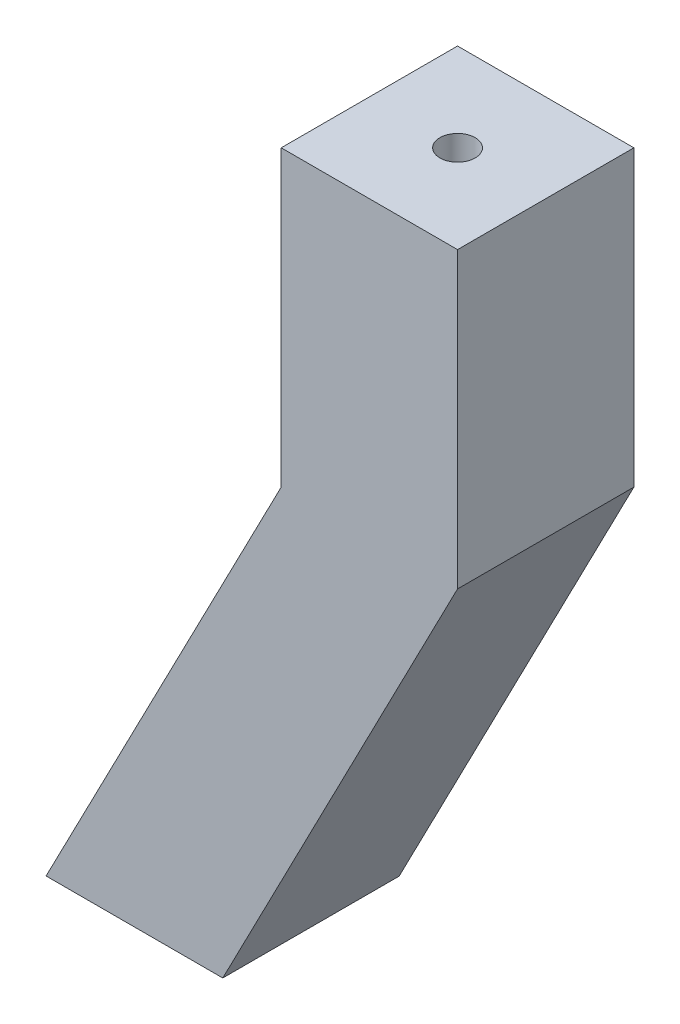
ISO-10303-21;
HEADER;
FILE_DESCRIPTION(('STEP AP214'),'2;1');
FILE_NAME('part.step','',(''),(''),'','','');
FILE_SCHEMA(('AUTOMOTIVE_DESIGN { 1 0 10303 214 1 1 1 1 }'));
ENDSEC;
DATA;
#1=APPLICATION_CONTEXT('core data for automotive mechanical design processes');
#2=APPLICATION_PROTOCOL_DEFINITION('international standard','automotive_design',2000,#1);
#3=PRODUCT_CONTEXT('',#1,'mechanical');
#4=PRODUCT('Part','Part','',(#3));
#5=PRODUCT_RELATED_PRODUCT_CATEGORY('part','',(#4));
#6=PRODUCT_DEFINITION_FORMATION('','',#4);
#7=PRODUCT_DEFINITION_CONTEXT('part definition',#1,'design');
#8=PRODUCT_DEFINITION('design','',#6,#7);
#9=PRODUCT_DEFINITION_SHAPE('','',#8);
#10=(LENGTH_UNIT() NAMED_UNIT(*) SI_UNIT(.MILLI.,.METRE.));
#11=(NAMED_UNIT(*) PLANE_ANGLE_UNIT() SI_UNIT($,.RADIAN.));
#12=(NAMED_UNIT(*) SI_UNIT($,.STERADIAN.) SOLID_ANGLE_UNIT());
#13=UNCERTAINTY_MEASURE_WITH_UNIT(LENGTH_MEASURE(1.E-05),#10,'distance_accuracy_value','');
#14=(GEOMETRIC_REPRESENTATION_CONTEXT(3) GLOBAL_UNCERTAINTY_ASSIGNED_CONTEXT((#13)) GLOBAL_UNIT_ASSIGNED_CONTEXT((#10,
#11,#12)) REPRESENTATION_CONTEXT('',''));
#15=CARTESIAN_POINT('',(0.,0.,0.));
#16=DIRECTION('',(0.,0.,1.));
#17=DIRECTION('',(1.,0.,0.));
#18=AXIS2_PLACEMENT_3D('',#15,#16,#17);
#19=CARTESIAN_POINT('',(15.,50.,-15.));
#20=DIRECTION('',(1.,0.,0.));
#21=DIRECTION('',(0.,0.,-1.));
#22=AXIS2_PLACEMENT_3D('',#19,#20,#21);
#23=PLANE('',#22);
#24=DIRECTION('',(0.,-1.,0.));
#25=VECTOR('',#24,1.);
#26=CARTESIAN_POINT('',(15.,50.,15.));
#27=LINE('',#26,#25);
#28=CARTESIAN_POINT('',(15.,50.,15.));
#29=VERTEX_POINT('',#28);
#30=CARTESIAN_POINT('',(15.,0.,15.));
#31=VERTEX_POINT('',#30);
#32=EDGE_CURVE('E44',#29,#31,#27,.T.);
#33=ORIENTED_EDGE('',*,*,#32,.T.);
#34=DIRECTION('',(0.,0.,1.));
#35=VECTOR('',#34,1.);
#36=CARTESIAN_POINT('',(15.,0.,-15.));
#37=LINE('',#36,#35);
#38=CARTESIAN_POINT('',(15.,0.,-15.));
#39=VERTEX_POINT('',#38);
#40=EDGE_CURVE('E96',#39,#31,#37,.T.);
#41=ORIENTED_EDGE('',*,*,#40,.F.);
#42=DIRECTION('',(0.,-1.,0.));
#43=VECTOR('',#42,1.);
#44=CARTESIAN_POINT('',(15.,50.,-15.));
#45=LINE('',#44,#43);
#46=CARTESIAN_POINT('',(15.,50.,-15.));
#47=VERTEX_POINT('',#46);
#48=EDGE_CURVE('E105',#47,#39,#45,.T.);
#49=ORIENTED_EDGE('',*,*,#48,.F.);
#50=DIRECTION('',(0.,0.,1.));
#51=VECTOR('',#50,1.);
#52=CARTESIAN_POINT('',(15.,50.,-15.));
#53=LINE('',#52,#51);
#54=EDGE_CURVE('E123',#47,#29,#53,.T.);
#55=ORIENTED_EDGE('',*,*,#54,.T.);
#56=EDGE_LOOP('',(#33,#41,#49,#55));
#57=FACE_BOUND('',#56,.T.);
#58=ADVANCED_FACE('F36',(#57),#23,.T.);
#59=CARTESIAN_POINT('',(-15.,50.,15.));
#60=DIRECTION('',(0.,0.,-1.));
#61=DIRECTION('',(-1.,0.,0.));
#62=AXIS2_PLACEMENT_3D('',#59,#60,#61);
#63=PLANE('',#62);
#64=DIRECTION('',(1.,0.,0.));
#65=VECTOR('',#64,1.);
#66=CARTESIAN_POINT('',(-55.,-77.301509620978,15.));
#67=LINE('',#66,#65);
#68=CARTESIAN_POINT('',(-55.,-77.301509620978,15.));
#69=VERTEX_POINT('',#68);
#70=CARTESIAN_POINT('',(-24.9464040213276,-77.301509620978,15.));
#71=VERTEX_POINT('',#70);
#72=EDGE_CURVE('E127',#69,#71,#67,.T.);
#73=ORIENTED_EDGE('',*,*,#72,.T.);
#74=DIRECTION('',(-0.459086185277864,-0.88839173481467,0.));
#75=VECTOR('',#74,1.);
#76=CARTESIAN_POINT('',(15.,0.,15.));
#77=LINE('',#76,#75);
#78=EDGE_CURVE('E51',#31,#71,#77,.T.);
#79=ORIENTED_EDGE('',*,*,#78,.F.);
#80=ORIENTED_EDGE('',*,*,#32,.F.);
#81=DIRECTION('',(1.,0.,0.));
#82=VECTOR('',#81,1.);
#83=CARTESIAN_POINT('',(-15.,50.,15.));
#84=LINE('',#83,#82);
#85=CARTESIAN_POINT('',(-15.,50.,15.));
#86=VERTEX_POINT('',#85);
#87=EDGE_CURVE('E125',#86,#29,#84,.T.);
#88=ORIENTED_EDGE('',*,*,#87,.F.);
#89=DIRECTION('',(0.,-1.,0.));
#90=VECTOR('',#89,1.);
#91=CARTESIAN_POINT('',(-15.,50.,15.));
#92=LINE('',#91,#90);
#93=CARTESIAN_POINT('',(-15.,0.,15.));
#94=VERTEX_POINT('',#93);
#95=EDGE_CURVE('E116',#86,#94,#92,.T.);
#96=ORIENTED_EDGE('',*,*,#95,.T.);
#97=DIRECTION('',(0.459667272074967,0.888091210959301,0.));
#98=VECTOR('',#97,1.);
#99=CARTESIAN_POINT('',(-15.,0.,15.));
#100=LINE('',#99,#98);
#101=CARTESIAN_POINT('',(-55.,-77.2812218673217,15.));
#102=VERTEX_POINT('',#101);
#103=EDGE_CURVE('E108',#102,#94,#100,.T.);
#104=ORIENTED_EDGE('',*,*,#103,.F.);
#105=DIRECTION('',(0.,-1.,0.));
#106=VECTOR('',#105,1.);
#107=CARTESIAN_POINT('',(-55.,10.,15.));
#108=LINE('',#107,#106);
#109=EDGE_CURVE('E134',#102,#69,#108,.T.);
#110=ORIENTED_EDGE('',*,*,#109,.T.);
#111=EDGE_LOOP('',(#73,#79,#80,#88,#96,#104,#110));
#112=FACE_BOUND('',#111,.T.);
#113=ADVANCED_FACE('F38',(#112),#63,.F.);
#114=CARTESIAN_POINT('',(-15.,50.,-15.));
#115=DIRECTION('',(0.,0.,-1.));
#116=DIRECTION('',(-1.,0.,0.));
#117=AXIS2_PLACEMENT_3D('',#114,#115,#116);
#118=PLANE('',#117);
#119=DIRECTION('',(-0.459086185277864,-0.88839173481467,0.));
#120=VECTOR('',#119,1.);
#121=CARTESIAN_POINT('',(15.,0.,-15.));
#122=LINE('',#121,#120);
#123=CARTESIAN_POINT('',(-24.9464040213276,-77.301509620978,-15.));
#124=VERTEX_POINT('',#123);
#125=EDGE_CURVE('E93',#39,#124,#122,.T.);
#126=ORIENTED_EDGE('',*,*,#125,.T.);
#127=DIRECTION('',(1.,0.,0.));
#128=VECTOR('',#127,1.);
#129=CARTESIAN_POINT('',(-55.,-77.301509620978,-15.));
#130=LINE('',#129,#128);
#131=CARTESIAN_POINT('',(-55.,-77.301509620978,-15.));
#132=VERTEX_POINT('',#131);
#133=EDGE_CURVE('E130',#132,#124,#130,.T.);
#134=ORIENTED_EDGE('',*,*,#133,.F.);
#135=DIRECTION('',(0.,-1.,0.));
#136=VECTOR('',#135,1.);
#137=CARTESIAN_POINT('',(-55.,10.,-15.));
#138=LINE('',#137,#136);
#139=CARTESIAN_POINT('',(-55.,-77.2812218673217,-15.));
#140=VERTEX_POINT('',#139);
#141=EDGE_CURVE('E132',#140,#132,#138,.T.);
#142=ORIENTED_EDGE('',*,*,#141,.F.);
#143=DIRECTION('',(0.459667272074967,0.888091210959301,0.));
#144=VECTOR('',#143,1.);
#145=CARTESIAN_POINT('',(-15.,0.,-15.));
#146=LINE('',#145,#144);
#147=CARTESIAN_POINT('',(-15.,0.,-15.));
#148=VERTEX_POINT('',#147);
#149=EDGE_CURVE('E145',#140,#148,#146,.T.);
#150=ORIENTED_EDGE('',*,*,#149,.T.);
#151=DIRECTION('',(0.,-1.,0.));
#152=VECTOR('',#151,1.);
#153=CARTESIAN_POINT('',(-15.,50.,-15.));
#154=LINE('',#153,#152);
#155=CARTESIAN_POINT('',(-15.,50.,-15.));
#156=VERTEX_POINT('',#155);
#157=EDGE_CURVE('E113',#156,#148,#154,.T.);
#158=ORIENTED_EDGE('',*,*,#157,.F.);
#159=DIRECTION('',(1.,0.,0.));
#160=VECTOR('',#159,1.);
#161=CARTESIAN_POINT('',(-15.,50.,-15.));
#162=LINE('',#161,#160);
#163=EDGE_CURVE('E112',#156,#47,#162,.T.);
#164=ORIENTED_EDGE('',*,*,#163,.T.);
#165=ORIENTED_EDGE('',*,*,#48,.T.);
#166=EDGE_LOOP('',(#126,#134,#142,#150,#158,#164,#165));
#167=FACE_BOUND('',#166,.T.);
#168=ADVANCED_FACE('F111',(#167),#118,.T.);
#169=CARTESIAN_POINT('',(-15.,50.,-15.));
#170=DIRECTION('',(1.,0.,0.));
#171=DIRECTION('',(0.,0.,-1.));
#172=AXIS2_PLACEMENT_3D('',#169,#170,#171);
#173=PLANE('',#172);
#174=ORIENTED_EDGE('',*,*,#157,.T.);
#175=DIRECTION('',(0.,0.,1.));
#176=VECTOR('',#175,1.);
#177=CARTESIAN_POINT('',(-15.,0.,-15.));
#178=LINE('',#177,#176);
#179=EDGE_CURVE('E139',#148,#94,#178,.T.);
#180=ORIENTED_EDGE('',*,*,#179,.T.);
#181=ORIENTED_EDGE('',*,*,#95,.F.);
#182=DIRECTION('',(0.,0.,1.));
#183=VECTOR('',#182,1.);
#184=CARTESIAN_POINT('',(-15.,50.,-15.));
#185=LINE('',#184,#183);
#186=EDGE_CURVE('E58',#156,#86,#185,.T.);
#187=ORIENTED_EDGE('',*,*,#186,.F.);
#188=EDGE_LOOP('',(#174,#180,#181,#187));
#189=FACE_BOUND('',#188,.T.);
#190=ADVANCED_FACE('F168',(#189),#173,.F.);
#191=CARTESIAN_POINT('',(0.,50.,0.));
#192=DIRECTION('',(0.,-1.,0.));
#193=DIRECTION('',(0.,0.,-1.));
#194=AXIS2_PLACEMENT_3D('',#191,#192,#193);
#195=PLANE('',#194);
#196=CARTESIAN_POINT('',(0.,50.,0.));
#197=DIRECTION('',(0.,1.,0.));
#198=DIRECTION('',(0.,0.,1.));
#199=AXIS2_PLACEMENT_3D('',#196,#197,#198);
#200=CIRCLE('',#199,3.);
#201=CARTESIAN_POINT('',(0.,50.,3.));
#202=VERTEX_POINT('',#201);
#203=EDGE_CURVE('E151',#202,#202,#200,.T.);
#204=ORIENTED_EDGE('',*,*,#203,.F.);
#205=EDGE_LOOP('',(#204));
#206=FACE_BOUND('',#205,.T.);
#207=ORIENTED_EDGE('',*,*,#87,.T.);
#208=ORIENTED_EDGE('',*,*,#54,.F.);
#209=ORIENTED_EDGE('',*,*,#163,.F.);
#210=ORIENTED_EDGE('',*,*,#186,.T.);
#211=EDGE_LOOP('',(#207,#208,#209,#210));
#212=FACE_BOUND('',#211,.T.);
#213=ADVANCED_FACE('F165',(#206,#212),#195,.F.);
#214=CARTESIAN_POINT('',(-55.,-77.301509620978,-15.));
#215=DIRECTION('',(0.,1.,0.));
#216=DIRECTION('',(0.,0.,1.));
#217=AXIS2_PLACEMENT_3D('',#214,#215,#216);
#218=PLANE('',#217);
#219=ORIENTED_EDGE('',*,*,#133,.T.);
#220=DIRECTION('',(0.,0.,1.));
#221=VECTOR('',#220,1.);
#222=CARTESIAN_POINT('',(-24.9464040213276,-77.301509620978,-15.));
#223=LINE('',#222,#221);
#224=EDGE_CURVE('E11',#124,#71,#223,.T.);
#225=ORIENTED_EDGE('',*,*,#224,.T.);
#226=ORIENTED_EDGE('',*,*,#72,.F.);
#227=DIRECTION('',(0.,0.,1.));
#228=VECTOR('',#227,1.);
#229=CARTESIAN_POINT('',(-55.,-77.301509620978,-15.));
#230=LINE('',#229,#228);
#231=EDGE_CURVE('E136',#132,#69,#230,.T.);
#232=ORIENTED_EDGE('',*,*,#231,.F.);
#233=EDGE_LOOP('',(#219,#225,#226,#232));
#234=FACE_BOUND('',#233,.T.);
#235=ADVANCED_FACE('F167',(#234),#218,.F.);
#236=CARTESIAN_POINT('',(-55.,0.,0.));
#237=DIRECTION('',(1.,0.,0.));
#238=DIRECTION('',(0.,0.,-1.));
#239=AXIS2_PLACEMENT_3D('',#236,#237,#238);
#240=PLANE('',#239);
#241=ORIENTED_EDGE('',*,*,#109,.F.);
#242=DIRECTION('',(0.,0.,-1.));
#243=VECTOR('',#242,1.);
#244=CARTESIAN_POINT('',(-55.,-77.2812218673217,0.));
#245=LINE('',#244,#243);
#246=EDGE_CURVE('E142',#102,#140,#245,.T.);
#247=ORIENTED_EDGE('',*,*,#246,.T.);
#248=ORIENTED_EDGE('',*,*,#141,.T.);
#249=ORIENTED_EDGE('',*,*,#231,.T.);
#250=EDGE_LOOP('',(#241,#247,#248,#249));
#251=FACE_BOUND('',#250,.T.);
#252=ADVANCED_FACE('F179',(#251),#240,.F.);
#253=CARTESIAN_POINT('',(-15.,0.,-15.));
#254=DIRECTION('',(0.888091210959301,-0.459667272074967,0.));
#255=DIRECTION('',(0.459667272074967,0.888091210959301,0.));
#256=AXIS2_PLACEMENT_3D('',#253,#254,#255);
#257=PLANE('',#256);
#258=ORIENTED_EDGE('',*,*,#103,.T.);
#259=ORIENTED_EDGE('',*,*,#179,.F.);
#260=ORIENTED_EDGE('',*,*,#149,.F.);
#261=ORIENTED_EDGE('',*,*,#246,.F.);
#262=EDGE_LOOP('',(#258,#259,#260,#261));
#263=FACE_BOUND('',#262,.T.);
#264=ADVANCED_FACE('F181',(#263),#257,.F.);
#265=CARTESIAN_POINT('',(15.,0.,-15.));
#266=DIRECTION('',(-0.88839173481467,0.459086185277864,0.));
#267=DIRECTION('',(-0.459086185277864,-0.88839173481467,0.));
#268=AXIS2_PLACEMENT_3D('',#265,#266,#267);
#269=PLANE('',#268);
#270=ORIENTED_EDGE('',*,*,#125,.F.);
#271=ORIENTED_EDGE('',*,*,#40,.T.);
#272=ORIENTED_EDGE('',*,*,#78,.T.);
#273=ORIENTED_EDGE('',*,*,#224,.F.);
#274=EDGE_LOOP('',(#270,#271,#272,#273));
#275=FACE_BOUND('',#274,.T.);
#276=ADVANCED_FACE('F95',(#275),#269,.F.);
#277=CARTESIAN_POINT('',(0.,0.,0.));
#278=DIRECTION('',(0.,1.,0.));
#279=DIRECTION('',(0.,0.,1.));
#280=AXIS2_PLACEMENT_3D('',#277,#278,#279);
#281=CYLINDRICAL_SURFACE('',#280,3.);
#282=CARTESIAN_POINT('',(0.,0.,0.));
#283=DIRECTION('',(0.,1.,0.));
#284=DIRECTION('',(0.,0.,1.));
#285=AXIS2_PLACEMENT_3D('',#282,#283,#284);
#286=CIRCLE('',#285,3.);
#287=CARTESIAN_POINT('',(0.,0.,3.));
#288=VERTEX_POINT('',#287);
#289=EDGE_CURVE('E149',#288,#288,#286,.T.);
#290=ORIENTED_EDGE('',*,*,#289,.F.);
#291=EDGE_LOOP('',(#290));
#292=FACE_BOUND('',#291,.T.);
#293=ORIENTED_EDGE('',*,*,#203,.T.);
#294=EDGE_LOOP('',(#293));
#295=FACE_BOUND('',#294,.T.);
#296=ADVANCED_FACE('F159',(#292,#295),#281,.F.);
#297=CARTESIAN_POINT('',(0.,0.,0.));
#298=DIRECTION('',(0.,1.,0.));
#299=DIRECTION('',(0.,0.,1.));
#300=AXIS2_PLACEMENT_3D('',#297,#298,#299);
#301=PLANE('',#300);
#302=ORIENTED_EDGE('',*,*,#289,.T.);
#303=EDGE_LOOP('',(#302));
#304=FACE_BOUND('',#303,.T.);
#305=ADVANCED_FACE('F157',(#304),#301,.T.);
#306=CLOSED_SHELL('',(#58,#113,#168,#190,#213,#235,#252,#264,#276,#296,#305));
#307=MANIFOLD_SOLID_BREP('B2',#306);
#308=ADVANCED_BREP_SHAPE_REPRESENTATION('',(#18,#307),#14);
#309=SHAPE_DEFINITION_REPRESENTATION(#9,#308);
ENDSEC;
END-ISO-10303-21;
